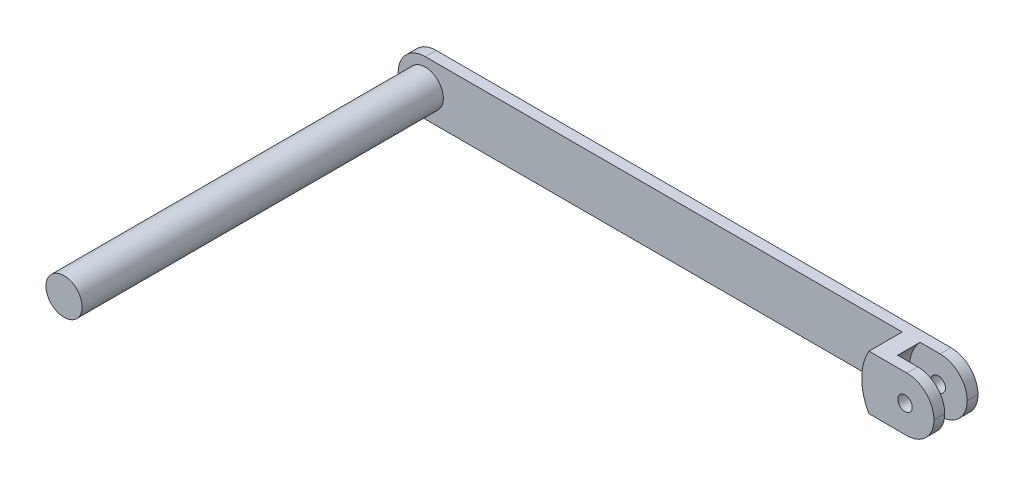
ISO-10303-21;
HEADER;
FILE_DESCRIPTION(('STEP AP214'),'2;1');
FILE_NAME('part.step','',(''),(''),'','','');
FILE_SCHEMA(('AUTOMOTIVE_DESIGN { 1 0 10303 214 1 1 1 1 }'));
ENDSEC;
DATA;
#1=APPLICATION_CONTEXT('core data for automotive mechanical design processes');
#2=APPLICATION_PROTOCOL_DEFINITION('international standard','automotive_design',2000,#1);
#3=PRODUCT_CONTEXT('',#1,'mechanical');
#4=PRODUCT('Part','Part','',(#3));
#5=PRODUCT_RELATED_PRODUCT_CATEGORY('part','',(#4));
#6=PRODUCT_DEFINITION_FORMATION('','',#4);
#7=PRODUCT_DEFINITION_CONTEXT('part definition',#1,'design');
#8=PRODUCT_DEFINITION('design','',#6,#7);
#9=PRODUCT_DEFINITION_SHAPE('','',#8);
#10=(LENGTH_UNIT() NAMED_UNIT(*) SI_UNIT(.MILLI.,.METRE.));
#11=(NAMED_UNIT(*) PLANE_ANGLE_UNIT() SI_UNIT($,.RADIAN.));
#12=(NAMED_UNIT(*) SI_UNIT($,.STERADIAN.) SOLID_ANGLE_UNIT());
#13=UNCERTAINTY_MEASURE_WITH_UNIT(LENGTH_MEASURE(1.E-05),#10,'distance_accuracy_value','');
#14=(GEOMETRIC_REPRESENTATION_CONTEXT(3) GLOBAL_UNCERTAINTY_ASSIGNED_CONTEXT((#13)) GLOBAL_UNIT_ASSIGNED_CONTEXT((#10,
#11,#12)) REPRESENTATION_CONTEXT('',''));
#15=CARTESIAN_POINT('',(0.,0.,0.));
#16=DIRECTION('',(0.,0.,1.));
#17=DIRECTION('',(1.,0.,0.));
#18=AXIS2_PLACEMENT_3D('',#15,#16,#17);
#19=CARTESIAN_POINT('',(0.,0.,3.));
#20=DIRECTION('',(0.,0.,1.));
#21=DIRECTION('',(1.,0.,0.));
#22=AXIS2_PLACEMENT_3D('',#19,#20,#21);
#23=PLANE('',#22);
#24=CARTESIAN_POINT('',(142.,0.,3.));
#25=DIRECTION('',(0.,0.,1.));
#26=DIRECTION('',(1.,0.,0.));
#27=AXIS2_PLACEMENT_3D('',#24,#25,#26);
#28=CIRCLE('',#27,2.);
#29=CARTESIAN_POINT('',(144.,0.,3.));
#30=VERTEX_POINT('',#29);
#31=EDGE_CURVE('E159',#30,#30,#28,.T.);
#32=ORIENTED_EDGE('',*,*,#31,.F.);
#33=EDGE_LOOP('',(#32));
#34=FACE_BOUND('',#33,.T.);
#35=DIRECTION('',(1.,0.,0.));
#36=VECTOR('',#35,1.);
#37=CARTESIAN_POINT('',(0.,-7.5,3.));
#38=LINE('',#37,#36);
#39=CARTESIAN_POINT('',(136.953261530284,-7.49999999999999,3.));
#40=VERTEX_POINT('',#39);
#41=CARTESIAN_POINT('',(142.5,-7.5,3.));
#42=VERTEX_POINT('',#41);
#43=EDGE_CURVE('E137',#40,#42,#38,.T.);
#44=ORIENTED_EDGE('',*,*,#43,.T.);
#45=CARTESIAN_POINT('',(142.5,0.,3.));
#46=DIRECTION('',(0.,0.,1.));
#47=DIRECTION('',(1.,0.,0.));
#48=AXIS2_PLACEMENT_3D('',#45,#46,#47);
#49=CIRCLE('',#48,7.5);
#50=CARTESIAN_POINT('',(150.,0.,3.));
#51=VERTEX_POINT('',#50);
#52=EDGE_CURVE('E218',#42,#51,#49,.T.);
#53=ORIENTED_EDGE('',*,*,#52,.T.);
#54=CARTESIAN_POINT('',(142.5,0.,3.));
#55=DIRECTION('',(0.,0.,1.));
#56=DIRECTION('',(1.,0.,0.));
#57=AXIS2_PLACEMENT_3D('',#54,#55,#56);
#58=CIRCLE('',#57,7.5);
#59=CARTESIAN_POINT('',(142.5,7.5,3.));
#60=VERTEX_POINT('',#59);
#61=EDGE_CURVE('E216',#51,#60,#58,.T.);
#62=ORIENTED_EDGE('',*,*,#61,.T.);
#63=DIRECTION('',(-1.,0.,0.));
#64=VECTOR('',#63,1.);
#65=CARTESIAN_POINT('',(0.,7.5,3.));
#66=LINE('',#65,#64);
#67=CARTESIAN_POINT('',(136.953261530284,7.5,3.));
#68=VERTEX_POINT('',#67);
#69=EDGE_CURVE('E191',#60,#68,#66,.T.);
#70=ORIENTED_EDGE('',*,*,#69,.T.);
#71=CARTESIAN_POINT('',(145.,0.,3.));
#72=DIRECTION('',(0.,0.,-1.));
#73=DIRECTION('',(1.,0.,0.));
#74=AXIS2_PLACEMENT_3D('',#71,#72,#73);
#75=CIRCLE('',#74,11.);
#76=EDGE_CURVE('E152',#40,#68,#75,.T.);
#77=ORIENTED_EDGE('',*,*,#76,.F.);
#78=EDGE_LOOP('',(#44,#53,#62,#70,#77));
#79=FACE_BOUND('',#78,.T.);
#80=ADVANCED_FACE('F39',(#34,#79),#23,.T.);
#81=CARTESIAN_POINT('',(0.,0.,3.));
#82=DIRECTION('',(0.,0.,1.));
#83=DIRECTION('',(1.,0.,0.));
#84=AXIS2_PLACEMENT_3D('',#81,#82,#83);
#85=CIRCLE('',#84,5.);
#86=CARTESIAN_POINT('',(5.,0.,3.));
#87=VERTEX_POINT('',#86);
#88=EDGE_CURVE('E179',#87,#87,#85,.T.);
#89=ORIENTED_EDGE('',*,*,#88,.F.);
#90=EDGE_LOOP('',(#89));
#91=FACE_BOUND('',#90,.T.);
#92=CARTESIAN_POINT('',(0.,-7.5,3.));
#93=VERTEX_POINT('',#92);
#94=CARTESIAN_POINT('',(132.009618943233,-7.5,3.));
#95=VERTEX_POINT('',#94);
#96=EDGE_CURVE('E187',#93,#95,#38,.T.);
#97=ORIENTED_EDGE('',*,*,#96,.T.);
#98=CARTESIAN_POINT('',(145.,0.,3.));
#99=DIRECTION('',(0.,0.,1.));
#100=DIRECTION('',(1.,0.,0.));
#101=AXIS2_PLACEMENT_3D('',#98,#99,#100);
#102=CIRCLE('',#101,15.);
#103=CARTESIAN_POINT('',(132.009618943233,7.5,3.));
#104=VERTEX_POINT('',#103);
#105=EDGE_CURVE('E166',#104,#95,#102,.T.);
#106=ORIENTED_EDGE('',*,*,#105,.F.);
#107=CARTESIAN_POINT('',(0.,7.5,3.));
#108=VERTEX_POINT('',#107);
#109=EDGE_CURVE('E190',#104,#108,#66,.T.);
#110=ORIENTED_EDGE('',*,*,#109,.T.);
#111=CARTESIAN_POINT('',(0.,0.,3.));
#112=DIRECTION('',(0.,0.,1.));
#113=DIRECTION('',(1.,0.,0.));
#114=AXIS2_PLACEMENT_3D('',#111,#112,#113);
#115=CIRCLE('',#114,7.5);
#116=EDGE_CURVE('E183',#108,#93,#115,.T.);
#117=ORIENTED_EDGE('',*,*,#116,.T.);
#118=EDGE_LOOP('',(#97,#106,#110,#117));
#119=FACE_BOUND('',#118,.T.);
#120=ADVANCED_FACE('F253',(#91,#119),#23,.T.);
#121=CARTESIAN_POINT('',(0.,0.,3.));
#122=DIRECTION('',(0.,0.,-1.));
#123=DIRECTION('',(-1.,0.,0.));
#124=AXIS2_PLACEMENT_3D('',#121,#122,#123);
#125=CYLINDRICAL_SURFACE('',#124,7.5);
#126=CARTESIAN_POINT('',(0.,0.,0.));
#127=DIRECTION('',(0.,0.,1.));
#128=DIRECTION('',(1.,0.,0.));
#129=AXIS2_PLACEMENT_3D('',#126,#127,#128);
#130=CIRCLE('',#129,7.5);
#131=CARTESIAN_POINT('',(0.,7.5,0.));
#132=VERTEX_POINT('',#131);
#133=CARTESIAN_POINT('',(0.,-7.5,0.));
#134=VERTEX_POINT('',#133);
#135=EDGE_CURVE('E182',#132,#134,#130,.T.);
#136=ORIENTED_EDGE('',*,*,#135,.T.);
#137=DIRECTION('',(0.,0.,-1.));
#138=VECTOR('',#137,1.);
#139=CARTESIAN_POINT('',(0.,-7.5,3.));
#140=LINE('',#139,#138);
#141=EDGE_CURVE('E201',#93,#134,#140,.T.);
#142=ORIENTED_EDGE('',*,*,#141,.F.);
#143=ORIENTED_EDGE('',*,*,#116,.F.);
#144=DIRECTION('',(0.,0.,-1.));
#145=VECTOR('',#144,1.);
#146=CARTESIAN_POINT('',(0.,7.5,3.));
#147=LINE('',#146,#145);
#148=EDGE_CURVE('E193',#108,#132,#147,.T.);
#149=ORIENTED_EDGE('',*,*,#148,.T.);
#150=EDGE_LOOP('',(#136,#142,#143,#149));
#151=FACE_BOUND('',#150,.T.);
#152=ADVANCED_FACE('F258',(#151),#125,.T.);
#153=CARTESIAN_POINT('',(0.,-7.5,3.));
#154=DIRECTION('',(0.,1.,0.));
#155=DIRECTION('',(0.,0.,1.));
#156=AXIS2_PLACEMENT_3D('',#153,#154,#155);
#157=PLANE('',#156);
#158=DIRECTION('',(1.,0.,0.));
#159=VECTOR('',#158,1.);
#160=CARTESIAN_POINT('',(0.,-7.5,0.));
#161=LINE('',#160,#159);
#162=CARTESIAN_POINT('',(142.5,-7.5,0.));
#163=VERTEX_POINT('',#162);
#164=EDGE_CURVE('E196',#134,#163,#161,.T.);
#165=ORIENTED_EDGE('',*,*,#164,.T.);
#166=DIRECTION('',(0.,0.,-1.));
#167=VECTOR('',#166,1.);
#168=CARTESIAN_POINT('',(142.5,-7.5,3.));
#169=LINE('',#168,#167);
#170=EDGE_CURVE('E214',#163,#42,#169,.F.);
#171=ORIENTED_EDGE('',*,*,#170,.T.);
#172=ORIENTED_EDGE('',*,*,#43,.F.);
#173=DIRECTION('',(0.,0.,-1.));
#174=VECTOR('',#173,1.);
#175=CARTESIAN_POINT('',(136.953261530284,-7.49999999999999,12.2));
#176=LINE('',#175,#174);
#177=CARTESIAN_POINT('',(136.953261530284,-7.49999999999999,9.2));
#178=VERTEX_POINT('',#177);
#179=EDGE_CURVE('E127',#178,#40,#176,.T.);
#180=ORIENTED_EDGE('',*,*,#179,.F.);
#181=DIRECTION('',(1.,0.,0.));
#182=VECTOR('',#181,1.);
#183=CARTESIAN_POINT('',(-7.50100000000001,-7.49999999999999,9.2));
#184=LINE('',#183,#182);
#185=CARTESIAN_POINT('',(142.5,-7.49999999999999,9.2));
#186=VERTEX_POINT('',#185);
#187=EDGE_CURVE('E133',#178,#186,#184,.T.);
#188=ORIENTED_EDGE('',*,*,#187,.T.);
#189=DIRECTION('',(0.,0.,-1.));
#190=VECTOR('',#189,1.);
#191=CARTESIAN_POINT('',(142.5,-7.5,3.));
#192=LINE('',#191,#190);
#193=CARTESIAN_POINT('',(142.5,-7.49999999999999,12.2));
#194=VERTEX_POINT('',#193);
#195=EDGE_CURVE('E212',#186,#194,#192,.F.);
#196=ORIENTED_EDGE('',*,*,#195,.T.);
#197=DIRECTION('',(1.,0.,0.));
#198=VECTOR('',#197,1.);
#199=CARTESIAN_POINT('',(132.009618943233,-7.49999999999999,12.2));
#200=LINE('',#199,#198);
#201=CARTESIAN_POINT('',(132.009618943233,-7.49999999999999,12.2));
#202=VERTEX_POINT('',#201);
#203=EDGE_CURVE('E142',#202,#194,#200,.T.);
#204=ORIENTED_EDGE('',*,*,#203,.F.);
#205=DIRECTION('',(0.,0.,-1.));
#206=VECTOR('',#205,1.);
#207=CARTESIAN_POINT('',(132.009618943233,-7.49999999999999,12.2));
#208=LINE('',#207,#206);
#209=EDGE_CURVE('E141',#202,#95,#208,.T.);
#210=ORIENTED_EDGE('',*,*,#209,.T.);
#211=ORIENTED_EDGE('',*,*,#96,.F.);
#212=ORIENTED_EDGE('',*,*,#141,.T.);
#213=EDGE_LOOP('',(#165,#171,#172,#180,#188,#196,#204,#210,#211,#212));
#214=FACE_BOUND('',#213,.T.);
#215=ADVANCED_FACE('F130',(#214),#157,.F.);
#216=CARTESIAN_POINT('',(0.,7.5,3.));
#217=DIRECTION('',(0.,-1.,0.));
#218=DIRECTION('',(0.,0.,-1.));
#219=AXIS2_PLACEMENT_3D('',#216,#217,#218);
#220=PLANE('',#219);
#221=ORIENTED_EDGE('',*,*,#69,.F.);
#222=DIRECTION('',(0.,0.,-1.));
#223=VECTOR('',#222,1.);
#224=CARTESIAN_POINT('',(142.5,7.5,3.));
#225=LINE('',#224,#223);
#226=CARTESIAN_POINT('',(142.5,7.5,0.));
#227=VERTEX_POINT('',#226);
#228=EDGE_CURVE('E11',#60,#227,#225,.T.);
#229=ORIENTED_EDGE('',*,*,#228,.T.);
#230=DIRECTION('',(-1.,0.,0.));
#231=VECTOR('',#230,1.);
#232=CARTESIAN_POINT('',(0.,7.5,0.));
#233=LINE('',#232,#231);
#234=EDGE_CURVE('E186',#227,#132,#233,.T.);
#235=ORIENTED_EDGE('',*,*,#234,.T.);
#236=ORIENTED_EDGE('',*,*,#148,.F.);
#237=ORIENTED_EDGE('',*,*,#109,.F.);
#238=DIRECTION('',(0.,0.,-1.));
#239=VECTOR('',#238,1.);
#240=CARTESIAN_POINT('',(132.009618943233,7.5,12.2));
#241=LINE('',#240,#239);
#242=CARTESIAN_POINT('',(132.009618943233,7.5,12.2));
#243=VERTEX_POINT('',#242);
#244=EDGE_CURVE('E173',#243,#104,#241,.T.);
#245=ORIENTED_EDGE('',*,*,#244,.F.);
#246=DIRECTION('',(-1.,0.,0.));
#247=VECTOR('',#246,1.);
#248=CARTESIAN_POINT('',(136.953261530284,7.5,12.2));
#249=LINE('',#248,#247);
#250=CARTESIAN_POINT('',(142.5,7.5,12.2));
#251=VERTEX_POINT('',#250);
#252=EDGE_CURVE('E163',#251,#243,#249,.T.);
#253=ORIENTED_EDGE('',*,*,#252,.F.);
#254=DIRECTION('',(0.,0.,1.));
#255=VECTOR('',#254,1.);
#256=CARTESIAN_POINT('',(142.5,7.5,3.));
#257=LINE('',#256,#255);
#258=CARTESIAN_POINT('',(142.5,7.5,9.2));
#259=VERTEX_POINT('',#258);
#260=EDGE_CURVE('E48',#251,#259,#257,.F.);
#261=ORIENTED_EDGE('',*,*,#260,.T.);
#262=DIRECTION('',(1.,0.,0.));
#263=VECTOR('',#262,1.);
#264=CARTESIAN_POINT('',(-7.50100000000001,7.5,9.2));
#265=LINE('',#264,#263);
#266=CARTESIAN_POINT('',(136.953261530284,7.5,9.2));
#267=VERTEX_POINT('',#266);
#268=EDGE_CURVE('E157',#267,#259,#265,.T.);
#269=ORIENTED_EDGE('',*,*,#268,.F.);
#270=DIRECTION('',(0.,0.,-1.));
#271=VECTOR('',#270,1.);
#272=CARTESIAN_POINT('',(136.953261530284,7.5,12.2));
#273=LINE('',#272,#271);
#274=EDGE_CURVE('E148',#267,#68,#273,.T.);
#275=ORIENTED_EDGE('',*,*,#274,.T.);
#276=EDGE_LOOP('',(#221,#229,#235,#236,#237,#245,#253,#261,#269,#275));
#277=FACE_BOUND('',#276,.T.);
#278=ADVANCED_FACE('F242',(#277),#220,.F.);
#279=CARTESIAN_POINT('',(0.,0.,0.));
#280=DIRECTION('',(0.,0.,1.));
#281=DIRECTION('',(1.,0.,0.));
#282=AXIS2_PLACEMENT_3D('',#279,#280,#281);
#283=PLANE('',#282);
#284=CARTESIAN_POINT('',(142.,0.,0.));
#285=DIRECTION('',(0.,0.,1.));
#286=DIRECTION('',(1.,0.,0.));
#287=AXIS2_PLACEMENT_3D('',#284,#285,#286);
#288=CIRCLE('',#287,2.);
#289=CARTESIAN_POINT('',(144.,0.,0.));
#290=VERTEX_POINT('',#289);
#291=EDGE_CURVE('E208',#290,#290,#288,.T.);
#292=ORIENTED_EDGE('',*,*,#291,.T.);
#293=EDGE_LOOP('',(#292));
#294=FACE_BOUND('',#293,.T.);
#295=CARTESIAN_POINT('',(142.5,0.,0.));
#296=DIRECTION('',(0.,0.,1.));
#297=DIRECTION('',(1.,0.,0.));
#298=AXIS2_PLACEMENT_3D('',#295,#296,#297);
#299=CIRCLE('',#298,7.5);
#300=CARTESIAN_POINT('',(150.,0.,0.));
#301=VERTEX_POINT('',#300);
#302=EDGE_CURVE('E204',#227,#301,#299,.F.);
#303=ORIENTED_EDGE('',*,*,#302,.T.);
#304=CARTESIAN_POINT('',(142.5,0.,0.));
#305=DIRECTION('',(0.,0.,1.));
#306=DIRECTION('',(1.,0.,0.));
#307=AXIS2_PLACEMENT_3D('',#304,#305,#306);
#308=CIRCLE('',#307,7.5);
#309=EDGE_CURVE('E210',#301,#163,#308,.F.);
#310=ORIENTED_EDGE('',*,*,#309,.T.);
#311=ORIENTED_EDGE('',*,*,#164,.F.);
#312=ORIENTED_EDGE('',*,*,#135,.F.);
#313=ORIENTED_EDGE('',*,*,#234,.F.);
#314=EDGE_LOOP('',(#303,#310,#311,#312,#313));
#315=FACE_BOUND('',#314,.T.);
#316=ADVANCED_FACE('F270',(#294,#315),#283,.F.);
#317=CARTESIAN_POINT('',(0.,0.,11.));
#318=DIRECTION('',(0.,0.,-1.));
#319=DIRECTION('',(-1.,0.,0.));
#320=AXIS2_PLACEMENT_3D('',#317,#318,#319);
#321=CYLINDRICAL_SURFACE('',#320,5.);
#322=ORIENTED_EDGE('',*,*,#88,.T.);
#323=EDGE_LOOP('',(#322));
#324=FACE_BOUND('',#323,.T.);
#325=CARTESIAN_POINT('',(0.,0.,103.));
#326=DIRECTION('',(0.,0.,1.));
#327=DIRECTION('',(1.,0.,0.));
#328=AXIS2_PLACEMENT_3D('',#325,#326,#327);
#329=CIRCLE('',#328,5.);
#330=CARTESIAN_POINT('',(5.,0.,103.));
#331=VERTEX_POINT('',#330);
#332=EDGE_CURVE('E176',#331,#331,#329,.T.);
#333=ORIENTED_EDGE('',*,*,#332,.F.);
#334=EDGE_LOOP('',(#333));
#335=FACE_BOUND('',#334,.T.);
#336=ADVANCED_FACE('F272',(#324,#335),#321,.T.);
#337=CARTESIAN_POINT('',(0.,0.,103.));
#338=DIRECTION('',(0.,0.,1.));
#339=DIRECTION('',(1.,0.,0.));
#340=AXIS2_PLACEMENT_3D('',#337,#338,#339);
#341=PLANE('',#340);
#342=ORIENTED_EDGE('',*,*,#332,.T.);
#343=EDGE_LOOP('',(#342));
#344=FACE_BOUND('',#343,.T.);
#345=ADVANCED_FACE('F279',(#344),#341,.T.);
#346=CARTESIAN_POINT('',(145.,0.,12.2));
#347=DIRECTION('',(0.,0.,-1.));
#348=DIRECTION('',(-1.,0.,0.));
#349=AXIS2_PLACEMENT_3D('',#346,#347,#348);
#350=CYLINDRICAL_SURFACE('',#349,11.);
#351=ORIENTED_EDGE('',*,*,#274,.F.);
#352=CARTESIAN_POINT('',(145.,0.,9.2));
#353=DIRECTION('',(0.,0.,-1.));
#354=DIRECTION('',(-1.,0.,0.));
#355=AXIS2_PLACEMENT_3D('',#352,#353,#354);
#356=CIRCLE('',#355,11.);
#357=EDGE_CURVE('E145',#267,#178,#356,.F.);
#358=ORIENTED_EDGE('',*,*,#357,.T.);
#359=ORIENTED_EDGE('',*,*,#179,.T.);
#360=ORIENTED_EDGE('',*,*,#76,.T.);
#361=EDGE_LOOP('',(#351,#358,#359,#360));
#362=FACE_BOUND('',#361,.T.);
#363=ADVANCED_FACE('F146',(#362),#350,.F.);
#364=CARTESIAN_POINT('',(145.,0.,12.2));
#365=DIRECTION('',(0.,0.,-1.));
#366=DIRECTION('',(-1.,0.,0.));
#367=AXIS2_PLACEMENT_3D('',#364,#365,#366);
#368=CYLINDRICAL_SURFACE('',#367,15.);
#369=ORIENTED_EDGE('',*,*,#105,.T.);
#370=ORIENTED_EDGE('',*,*,#209,.F.);
#371=CARTESIAN_POINT('',(145.,0.,12.2));
#372=DIRECTION('',(0.,0.,1.));
#373=DIRECTION('',(1.,0.,0.));
#374=AXIS2_PLACEMENT_3D('',#371,#372,#373);
#375=CIRCLE('',#374,15.);
#376=EDGE_CURVE('E165',#243,#202,#375,.T.);
#377=ORIENTED_EDGE('',*,*,#376,.F.);
#378=ORIENTED_EDGE('',*,*,#244,.T.);
#379=EDGE_LOOP('',(#369,#370,#377,#378));
#380=FACE_BOUND('',#379,.T.);
#381=ADVANCED_FACE('F250',(#380),#368,.T.);
#382=CARTESIAN_POINT('',(145.,0.,12.2));
#383=DIRECTION('',(0.,0.,1.));
#384=DIRECTION('',(1.,0.,0.));
#385=AXIS2_PLACEMENT_3D('',#382,#383,#384);
#386=PLANE('',#385);
#387=CARTESIAN_POINT('',(142.,0.,12.2));
#388=DIRECTION('',(0.,0.,1.));
#389=DIRECTION('',(1.,0.,0.));
#390=AXIS2_PLACEMENT_3D('',#387,#388,#389);
#391=CIRCLE('',#390,2.);
#392=CARTESIAN_POINT('',(144.,0.,12.2));
#393=VERTEX_POINT('',#392);
#394=EDGE_CURVE('E227',#393,#393,#391,.T.);
#395=ORIENTED_EDGE('',*,*,#394,.F.);
#396=EDGE_LOOP('',(#395));
#397=FACE_BOUND('',#396,.T.);
#398=ORIENTED_EDGE('',*,*,#203,.T.);
#399=CARTESIAN_POINT('',(142.5,0.,12.2));
#400=DIRECTION('',(0.,0.,1.));
#401=DIRECTION('',(1.,0.,0.));
#402=AXIS2_PLACEMENT_3D('',#399,#400,#401);
#403=CIRCLE('',#402,7.5);
#404=CARTESIAN_POINT('',(150.,0.,12.2));
#405=VERTEX_POINT('',#404);
#406=EDGE_CURVE('E61',#194,#405,#403,.T.);
#407=ORIENTED_EDGE('',*,*,#406,.T.);
#408=CARTESIAN_POINT('',(142.5,0.,12.2));
#409=DIRECTION('',(0.,0.,1.));
#410=DIRECTION('',(1.,0.,0.));
#411=AXIS2_PLACEMENT_3D('',#408,#409,#410);
#412=CIRCLE('',#411,7.5);
#413=EDGE_CURVE('E56',#405,#251,#412,.T.);
#414=ORIENTED_EDGE('',*,*,#413,.T.);
#415=ORIENTED_EDGE('',*,*,#252,.T.);
#416=ORIENTED_EDGE('',*,*,#376,.T.);
#417=EDGE_LOOP('',(#398,#407,#414,#415,#416));
#418=FACE_BOUND('',#417,.T.);
#419=ADVANCED_FACE('F246',(#397,#418),#386,.T.);
#420=CARTESIAN_POINT('',(-7.50100000000001,-7.49999999999999,9.2));
#421=DIRECTION('',(0.,0.,-1.));
#422=DIRECTION('',(-1.,0.,0.));
#423=AXIS2_PLACEMENT_3D('',#420,#421,#422);
#424=PLANE('',#423);
#425=CARTESIAN_POINT('',(142.,0.,9.2));
#426=DIRECTION('',(0.,0.,-1.));
#427=DIRECTION('',(-1.,0.,0.));
#428=AXIS2_PLACEMENT_3D('',#425,#426,#427);
#429=CIRCLE('',#428,2.);
#430=CARTESIAN_POINT('',(140.,0.,9.2));
#431=VERTEX_POINT('',#430);
#432=EDGE_CURVE('E205',#431,#431,#429,.T.);
#433=ORIENTED_EDGE('',*,*,#432,.F.);
#434=EDGE_LOOP('',(#433));
#435=FACE_BOUND('',#434,.T.);
#436=CARTESIAN_POINT('',(142.5,0.,9.2));
#437=DIRECTION('',(0.,0.,-1.));
#438=DIRECTION('',(-1.,0.,0.));
#439=AXIS2_PLACEMENT_3D('',#436,#437,#438);
#440=CIRCLE('',#439,7.5);
#441=CARTESIAN_POINT('',(150.,0.,9.2));
#442=VERTEX_POINT('',#441);
#443=EDGE_CURVE('E220',#259,#442,#440,.T.);
#444=ORIENTED_EDGE('',*,*,#443,.T.);
#445=CARTESIAN_POINT('',(142.5,0.,9.2));
#446=DIRECTION('',(0.,0.,-1.));
#447=DIRECTION('',(-1.,0.,0.));
#448=AXIS2_PLACEMENT_3D('',#445,#446,#447);
#449=CIRCLE('',#448,7.5);
#450=EDGE_CURVE('E156',#442,#186,#449,.T.);
#451=ORIENTED_EDGE('',*,*,#450,.T.);
#452=ORIENTED_EDGE('',*,*,#187,.F.);
#453=ORIENTED_EDGE('',*,*,#357,.F.);
#454=ORIENTED_EDGE('',*,*,#268,.T.);
#455=EDGE_LOOP('',(#444,#451,#452,#453,#454));
#456=FACE_BOUND('',#455,.T.);
#457=ADVANCED_FACE('F154',(#435,#456),#424,.T.);
#458=CARTESIAN_POINT('',(142.,0.,0.));
#459=DIRECTION('',(0.,0.,1.));
#460=DIRECTION('',(1.,0.,0.));
#461=AXIS2_PLACEMENT_3D('',#458,#459,#460);
#462=CYLINDRICAL_SURFACE('',#461,2.);
#463=ORIENTED_EDGE('',*,*,#432,.T.);
#464=EDGE_LOOP('',(#463));
#465=FACE_BOUND('',#464,.T.);
#466=ORIENTED_EDGE('',*,*,#394,.T.);
#467=EDGE_LOOP('',(#466));
#468=FACE_BOUND('',#467,.T.);
#469=ADVANCED_FACE('F305',(#465,#468),#462,.F.);
#470=ORIENTED_EDGE('',*,*,#31,.T.);
#471=EDGE_LOOP('',(#470));
#472=FACE_BOUND('',#471,.T.);
#473=ORIENTED_EDGE('',*,*,#291,.F.);
#474=EDGE_LOOP('',(#473));
#475=FACE_BOUND('',#474,.T.);
#476=ADVANCED_FACE('F308',(#472,#475),#462,.F.);
#477=CARTESIAN_POINT('',(142.5,0.,3.));
#478=DIRECTION('',(0.,0.,-1.));
#479=DIRECTION('',(-1.,0.,0.));
#480=AXIS2_PLACEMENT_3D('',#477,#478,#479);
#481=CYLINDRICAL_SURFACE('',#480,7.5);
#482=ORIENTED_EDGE('',*,*,#228,.F.);
#483=ORIENTED_EDGE('',*,*,#61,.F.);
#484=DIRECTION('',(0.,0.,-1.));
#485=VECTOR('',#484,1.);
#486=CARTESIAN_POINT('',(150.,0.,3.));
#487=LINE('',#486,#485);
#488=EDGE_CURVE('E225',#301,#51,#487,.F.);
#489=ORIENTED_EDGE('',*,*,#488,.F.);
#490=ORIENTED_EDGE('',*,*,#302,.F.);
#491=EDGE_LOOP('',(#482,#483,#489,#490));
#492=FACE_BOUND('',#491,.T.);
#493=ADVANCED_FACE('F267',(#492),#481,.T.);
#494=CARTESIAN_POINT('',(142.5,0.,3.));
#495=DIRECTION('',(0.,0.,-1.));
#496=DIRECTION('',(-1.,0.,0.));
#497=AXIS2_PLACEMENT_3D('',#494,#495,#496);
#498=CYLINDRICAL_SURFACE('',#497,7.5);
#499=ORIENTED_EDGE('',*,*,#52,.F.);
#500=ORIENTED_EDGE('',*,*,#170,.F.);
#501=ORIENTED_EDGE('',*,*,#309,.F.);
#502=ORIENTED_EDGE('',*,*,#488,.T.);
#503=EDGE_LOOP('',(#499,#500,#501,#502));
#504=FACE_BOUND('',#503,.T.);
#505=ADVANCED_FACE('F262',(#504),#498,.T.);
#506=CARTESIAN_POINT('',(142.5,0.,0.));
#507=DIRECTION('',(0.,0.,1.));
#508=DIRECTION('',(1.,0.,0.));
#509=AXIS2_PLACEMENT_3D('',#506,#507,#508);
#510=CYLINDRICAL_SURFACE('',#509,7.5);
#511=ORIENTED_EDGE('',*,*,#260,.F.);
#512=ORIENTED_EDGE('',*,*,#413,.F.);
#513=DIRECTION('',(0.,0.,1.));
#514=VECTOR('',#513,1.);
#515=CARTESIAN_POINT('',(150.,0.,0.));
#516=LINE('',#515,#514);
#517=EDGE_CURVE('E43',#442,#405,#516,.T.);
#518=ORIENTED_EDGE('',*,*,#517,.F.);
#519=ORIENTED_EDGE('',*,*,#443,.F.);
#520=EDGE_LOOP('',(#511,#512,#518,#519));
#521=FACE_BOUND('',#520,.T.);
#522=ADVANCED_FACE('F41',(#521),#510,.T.);
#523=CARTESIAN_POINT('',(142.5,0.,0.));
#524=DIRECTION('',(0.,0.,-1.));
#525=DIRECTION('',(-1.,0.,0.));
#526=AXIS2_PLACEMENT_3D('',#523,#524,#525);
#527=CYLINDRICAL_SURFACE('',#526,7.5);
#528=ORIENTED_EDGE('',*,*,#406,.F.);
#529=ORIENTED_EDGE('',*,*,#195,.F.);
#530=ORIENTED_EDGE('',*,*,#450,.F.);
#531=ORIENTED_EDGE('',*,*,#517,.T.);
#532=EDGE_LOOP('',(#528,#529,#530,#531));
#533=FACE_BOUND('',#532,.T.);
#534=ADVANCED_FACE('F236',(#533),#527,.T.);
#535=CLOSED_SHELL('',(#80,#120,#152,#215,#278,#316,#336,#345,#363,#381,#419,#457,#469,#476,#493,
#505,#522,#534));
#536=MANIFOLD_SOLID_BREP('B2',#535);
#537=ADVANCED_BREP_SHAPE_REPRESENTATION('',(#18,#536),#14);
#538=SHAPE_DEFINITION_REPRESENTATION(#9,#537);
ENDSEC;
END-ISO-10303-21;
